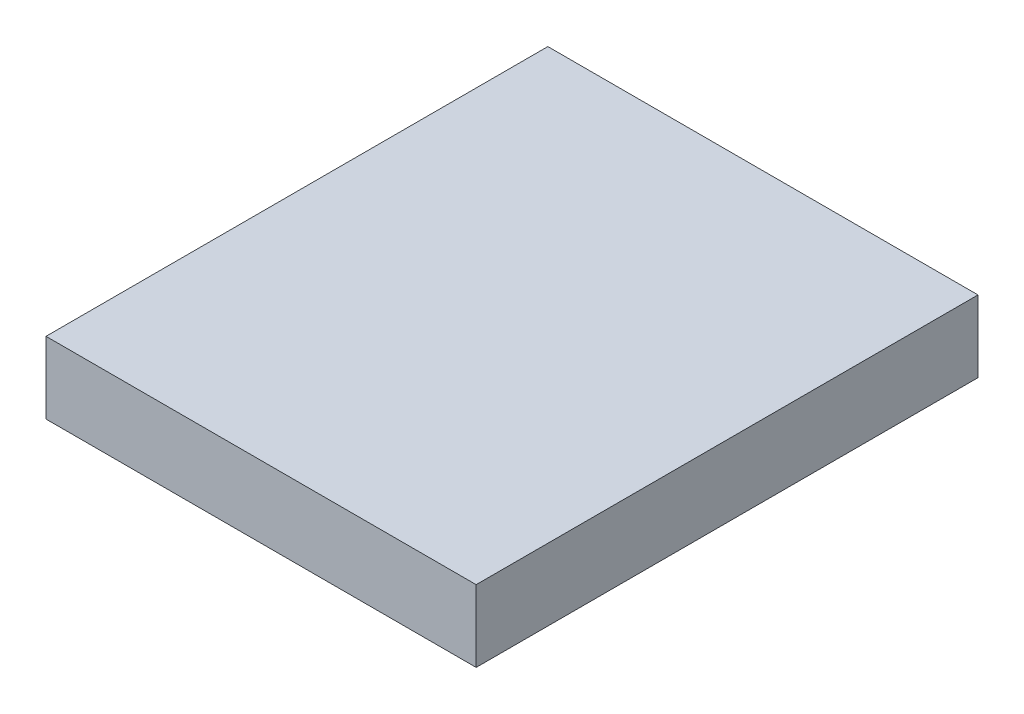
ISO-10303-21;
HEADER;
FILE_DESCRIPTION(('STEP AP214'),'2;1');
FILE_NAME('part.step','',(''),(''),'','','');
FILE_SCHEMA(('AUTOMOTIVE_DESIGN { 1 0 10303 214 1 1 1 1 }'));
ENDSEC;
DATA;
#1=APPLICATION_CONTEXT('core data for automotive mechanical design processes');
#2=APPLICATION_PROTOCOL_DEFINITION('international standard','automotive_design',2000,#1);
#3=PRODUCT_CONTEXT('',#1,'mechanical');
#4=PRODUCT('Part','Part','',(#3));
#5=PRODUCT_RELATED_PRODUCT_CATEGORY('part','',(#4));
#6=PRODUCT_DEFINITION_FORMATION('','',#4);
#7=PRODUCT_DEFINITION_CONTEXT('part definition',#1,'design');
#8=PRODUCT_DEFINITION('design','',#6,#7);
#9=PRODUCT_DEFINITION_SHAPE('','',#8);
#10=(LENGTH_UNIT() NAMED_UNIT(*) SI_UNIT(.MILLI.,.METRE.));
#11=(NAMED_UNIT(*) PLANE_ANGLE_UNIT() SI_UNIT($,.RADIAN.));
#12=(NAMED_UNIT(*) SI_UNIT($,.STERADIAN.) SOLID_ANGLE_UNIT());
#13=UNCERTAINTY_MEASURE_WITH_UNIT(LENGTH_MEASURE(1.E-05),#10,'distance_accuracy_value','');
#14=(GEOMETRIC_REPRESENTATION_CONTEXT(3) GLOBAL_UNCERTAINTY_ASSIGNED_CONTEXT((#13)) GLOBAL_UNIT_ASSIGNED_CONTEXT((#10,
#11,#12)) REPRESENTATION_CONTEXT('',''));
#15=CARTESIAN_POINT('',(0.,0.,0.));
#16=DIRECTION('',(0.,0.,1.));
#17=DIRECTION('',(1.,0.,0.));
#18=AXIS2_PLACEMENT_3D('',#15,#16,#17);
#19=CARTESIAN_POINT('',(228.6,76.2,266.7));
#20=DIRECTION('',(-1.,0.,0.));
#21=DIRECTION('',(0.,0.,1.));
#22=AXIS2_PLACEMENT_3D('',#19,#20,#21);
#23=PLANE('',#22);
#24=DIRECTION('',(0.,0.,-1.));
#25=VECTOR('',#24,1.);
#26=CARTESIAN_POINT('',(228.6,0.,266.7));
#27=LINE('',#26,#25);
#28=CARTESIAN_POINT('',(228.6,0.,266.7));
#29=VERTEX_POINT('',#28);
#30=CARTESIAN_POINT('',(228.6,0.,-266.7));
#31=VERTEX_POINT('',#30);
#32=EDGE_CURVE('E107',#29,#31,#27,.T.);
#33=ORIENTED_EDGE('',*,*,#32,.T.);
#34=DIRECTION('',(0.,-1.,0.));
#35=VECTOR('',#34,1.);
#36=CARTESIAN_POINT('',(228.6,76.2,-266.7));
#37=LINE('',#36,#35);
#38=CARTESIAN_POINT('',(228.6,76.2,-266.7));
#39=VERTEX_POINT('',#38);
#40=EDGE_CURVE('E11',#39,#31,#37,.T.);
#41=ORIENTED_EDGE('',*,*,#40,.F.);
#42=DIRECTION('',(0.,0.,-1.));
#43=VECTOR('',#42,1.);
#44=CARTESIAN_POINT('',(228.6,76.2,266.7));
#45=LINE('',#44,#43);
#46=CARTESIAN_POINT('',(228.6,76.2,266.7));
#47=VERTEX_POINT('',#46);
#48=EDGE_CURVE('E91',#47,#39,#45,.T.);
#49=ORIENTED_EDGE('',*,*,#48,.F.);
#50=DIRECTION('',(0.,-1.,0.));
#51=VECTOR('',#50,1.);
#52=CARTESIAN_POINT('',(228.6,76.2,266.7));
#53=LINE('',#52,#51);
#54=EDGE_CURVE('E103',#47,#29,#53,.T.);
#55=ORIENTED_EDGE('',*,*,#54,.T.);
#56=EDGE_LOOP('',(#33,#41,#49,#55));
#57=FACE_BOUND('',#56,.T.);
#58=ADVANCED_FACE('F39',(#57),#23,.F.);
#59=CARTESIAN_POINT('',(-228.6,76.2,-266.7));
#60=DIRECTION('',(0.,0.,1.));
#61=DIRECTION('',(1.,0.,0.));
#62=AXIS2_PLACEMENT_3D('',#59,#60,#61);
#63=PLANE('',#62);
#64=DIRECTION('',(-1.,0.,0.));
#65=VECTOR('',#64,1.);
#66=CARTESIAN_POINT('',(-228.6,0.,-266.7));
#67=LINE('',#66,#65);
#68=CARTESIAN_POINT('',(-228.6,0.,-266.7));
#69=VERTEX_POINT('',#68);
#70=EDGE_CURVE('E96',#31,#69,#67,.T.);
#71=ORIENTED_EDGE('',*,*,#70,.T.);
#72=DIRECTION('',(0.,-1.,0.));
#73=VECTOR('',#72,1.);
#74=CARTESIAN_POINT('',(-228.6,76.2,-266.7));
#75=LINE('',#74,#73);
#76=CARTESIAN_POINT('',(-228.6,76.2,-266.7));
#77=VERTEX_POINT('',#76);
#78=EDGE_CURVE('E48',#77,#69,#75,.T.);
#79=ORIENTED_EDGE('',*,*,#78,.F.);
#80=DIRECTION('',(-1.,0.,0.));
#81=VECTOR('',#80,1.);
#82=CARTESIAN_POINT('',(-228.6,76.2,-266.7));
#83=LINE('',#82,#81);
#84=EDGE_CURVE('E86',#39,#77,#83,.T.);
#85=ORIENTED_EDGE('',*,*,#84,.F.);
#86=ORIENTED_EDGE('',*,*,#40,.T.);
#87=EDGE_LOOP('',(#71,#79,#85,#86));
#88=FACE_BOUND('',#87,.T.);
#89=ADVANCED_FACE('F95',(#88),#63,.F.);
#90=CARTESIAN_POINT('',(-228.6,76.2,266.7));
#91=DIRECTION('',(1.,0.,0.));
#92=DIRECTION('',(0.,0.,-1.));
#93=AXIS2_PLACEMENT_3D('',#90,#91,#92);
#94=PLANE('',#93);
#95=DIRECTION('',(0.,0.,1.));
#96=VECTOR('',#95,1.);
#97=CARTESIAN_POINT('',(-228.6,0.,266.7));
#98=LINE('',#97,#96);
#99=CARTESIAN_POINT('',(-228.6,0.,266.7));
#100=VERTEX_POINT('',#99);
#101=EDGE_CURVE('E73',#69,#100,#98,.T.);
#102=ORIENTED_EDGE('',*,*,#101,.T.);
#103=DIRECTION('',(0.,-1.,0.));
#104=VECTOR('',#103,1.);
#105=CARTESIAN_POINT('',(-228.6,76.2,266.7));
#106=LINE('',#105,#104);
#107=CARTESIAN_POINT('',(-228.6,76.2,266.7));
#108=VERTEX_POINT('',#107);
#109=EDGE_CURVE('E98',#108,#100,#106,.T.);
#110=ORIENTED_EDGE('',*,*,#109,.F.);
#111=DIRECTION('',(0.,0.,1.));
#112=VECTOR('',#111,1.);
#113=CARTESIAN_POINT('',(-228.6,76.2,266.7));
#114=LINE('',#113,#112);
#115=EDGE_CURVE('E89',#77,#108,#114,.T.);
#116=ORIENTED_EDGE('',*,*,#115,.F.);
#117=ORIENTED_EDGE('',*,*,#78,.T.);
#118=EDGE_LOOP('',(#102,#110,#116,#117));
#119=FACE_BOUND('',#118,.T.);
#120=ADVANCED_FACE('F99',(#119),#94,.F.);
#121=CARTESIAN_POINT('',(-228.6,76.2,266.7));
#122=DIRECTION('',(0.,0.,-1.));
#123=DIRECTION('',(-1.,0.,0.));
#124=AXIS2_PLACEMENT_3D('',#121,#122,#123);
#125=PLANE('',#124);
#126=DIRECTION('',(1.,0.,0.));
#127=VECTOR('',#126,1.);
#128=CARTESIAN_POINT('',(-228.6,0.,266.7));
#129=LINE('',#128,#127);
#130=EDGE_CURVE('E79',#100,#29,#129,.T.);
#131=ORIENTED_EDGE('',*,*,#130,.T.);
#132=ORIENTED_EDGE('',*,*,#54,.F.);
#133=DIRECTION('',(1.,0.,0.));
#134=VECTOR('',#133,1.);
#135=CARTESIAN_POINT('',(-228.6,76.2,266.7));
#136=LINE('',#135,#134);
#137=EDGE_CURVE('E56',#108,#47,#136,.T.);
#138=ORIENTED_EDGE('',*,*,#137,.F.);
#139=ORIENTED_EDGE('',*,*,#109,.T.);
#140=EDGE_LOOP('',(#131,#132,#138,#139));
#141=FACE_BOUND('',#140,.T.);
#142=ADVANCED_FACE('F120',(#141),#125,.F.);
#143=CARTESIAN_POINT('',(0.,76.2,0.));
#144=DIRECTION('',(0.,-1.,0.));
#145=DIRECTION('',(0.,0.,-1.));
#146=AXIS2_PLACEMENT_3D('',#143,#144,#145);
#147=PLANE('',#146);
#148=ORIENTED_EDGE('',*,*,#48,.T.);
#149=ORIENTED_EDGE('',*,*,#84,.T.);
#150=ORIENTED_EDGE('',*,*,#115,.T.);
#151=ORIENTED_EDGE('',*,*,#137,.T.);
#152=EDGE_LOOP('',(#148,#149,#150,#151));
#153=FACE_BOUND('',#152,.T.);
#154=ADVANCED_FACE('F87',(#153),#147,.F.);
#155=CARTESIAN_POINT('',(0.,0.,0.));
#156=DIRECTION('',(0.,-1.,0.));
#157=DIRECTION('',(0.,0.,-1.));
#158=AXIS2_PLACEMENT_3D('',#155,#156,#157);
#159=PLANE('',#158);
#160=ORIENTED_EDGE('',*,*,#32,.F.);
#161=ORIENTED_EDGE('',*,*,#130,.F.);
#162=ORIENTED_EDGE('',*,*,#101,.F.);
#163=ORIENTED_EDGE('',*,*,#70,.F.);
#164=EDGE_LOOP('',(#160,#161,#162,#163));
#165=FACE_BOUND('',#164,.T.);
#166=ADVANCED_FACE('F123',(#165),#159,.T.);
#167=CLOSED_SHELL('',(#58,#89,#120,#142,#154,#166));
#168=MANIFOLD_SOLID_BREP('B2',#167);
#169=ADVANCED_BREP_SHAPE_REPRESENTATION('',(#18,#168),#14);
#170=SHAPE_DEFINITION_REPRESENTATION(#9,#169);
ENDSEC;
END-ISO-10303-21;
